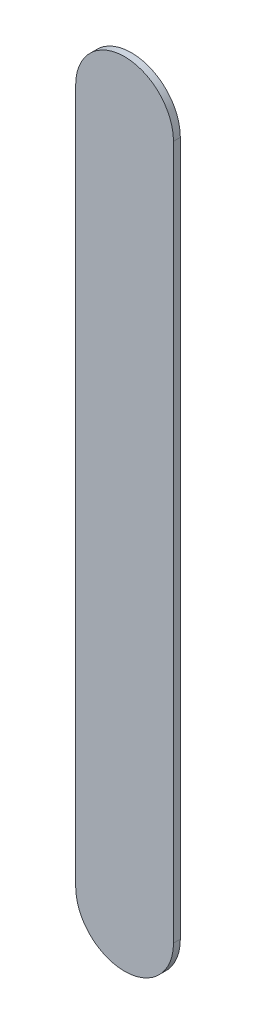
ISO-10303-21;
HEADER;
FILE_DESCRIPTION(('STEP AP214'),'2;1');
FILE_NAME('part.step','',(''),(''),'','','');
FILE_SCHEMA(('AUTOMOTIVE_DESIGN { 1 0 10303 214 1 1 1 1 }'));
ENDSEC;
DATA;
#1=APPLICATION_CONTEXT('core data for automotive mechanical design processes');
#2=APPLICATION_PROTOCOL_DEFINITION('international standard','automotive_design',2000,#1);
#3=PRODUCT_CONTEXT('',#1,'mechanical');
#4=PRODUCT('Part','Part','',(#3));
#5=PRODUCT_RELATED_PRODUCT_CATEGORY('part','',(#4));
#6=PRODUCT_DEFINITION_FORMATION('','',#4);
#7=PRODUCT_DEFINITION_CONTEXT('part definition',#1,'design');
#8=PRODUCT_DEFINITION('design','',#6,#7);
#9=PRODUCT_DEFINITION_SHAPE('','',#8);
#10=(LENGTH_UNIT() NAMED_UNIT(*) SI_UNIT(.MILLI.,.METRE.));
#11=(NAMED_UNIT(*) PLANE_ANGLE_UNIT() SI_UNIT($,.RADIAN.));
#12=(NAMED_UNIT(*) SI_UNIT($,.STERADIAN.) SOLID_ANGLE_UNIT());
#13=UNCERTAINTY_MEASURE_WITH_UNIT(LENGTH_MEASURE(1.E-05),#10,'distance_accuracy_value','');
#14=(GEOMETRIC_REPRESENTATION_CONTEXT(3) GLOBAL_UNCERTAINTY_ASSIGNED_CONTEXT((#13)) GLOBAL_UNIT_ASSIGNED_CONTEXT((#10,
#11,#12)) REPRESENTATION_CONTEXT('',''));
#15=CARTESIAN_POINT('',(0.,0.,0.));
#16=DIRECTION('',(0.,0.,1.));
#17=DIRECTION('',(1.,0.,0.));
#18=AXIS2_PLACEMENT_3D('',#15,#16,#17);
#19=CARTESIAN_POINT('',(113.52,-56.91,1.635));
#20=DIRECTION('',(0.,0.,1.));
#21=DIRECTION('',(1.,0.,0.));
#22=AXIS2_PLACEMENT_3D('',#19,#20,#21);
#23=PLANE('',#22);
#24=DIRECTION('',(0.,-1.,0.));
#25=VECTOR('',#24,1.);
#26=CARTESIAN_POINT('',(113.52,-56.91,1.635));
#27=LINE('',#26,#25);
#28=CARTESIAN_POINT('',(113.52,-56.91,1.635));
#29=VERTEX_POINT('',#28);
#30=CARTESIAN_POINT('',(113.52,-60.46,1.635));
#31=VERTEX_POINT('',#30);
#32=EDGE_CURVE('E82',#29,#31,#27,.T.);
#33=ORIENTED_EDGE('',*,*,#32,.T.);
#34=CARTESIAN_POINT('',(113.77,-60.46,1.635));
#35=DIRECTION('',(0.,0.,1.));
#36=DIRECTION('',(-1.,0.,0.));
#37=AXIS2_PLACEMENT_3D('',#34,#35,#36);
#38=CIRCLE('',#37,0.25);
#39=CARTESIAN_POINT('',(114.02,-60.46,1.635));
#40=VERTEX_POINT('',#39);
#41=EDGE_CURVE('E110',#31,#40,#38,.T.);
#42=ORIENTED_EDGE('',*,*,#41,.T.);
#43=DIRECTION('',(0.,1.,0.));
#44=VECTOR('',#43,1.);
#45=CARTESIAN_POINT('',(114.02,-60.46,1.635));
#46=LINE('',#45,#44);
#47=CARTESIAN_POINT('',(114.02,-56.91,1.635));
#48=VERTEX_POINT('',#47);
#49=EDGE_CURVE('E75',#40,#48,#46,.T.);
#50=ORIENTED_EDGE('',*,*,#49,.T.);
#51=CARTESIAN_POINT('',(113.77,-56.91,1.635));
#52=DIRECTION('',(0.,0.,1.));
#53=DIRECTION('',(1.,0.,0.));
#54=AXIS2_PLACEMENT_3D('',#51,#52,#53);
#55=CIRCLE('',#54,0.25);
#56=EDGE_CURVE('E11',#48,#29,#55,.T.);
#57=ORIENTED_EDGE('',*,*,#56,.T.);
#58=EDGE_LOOP('',(#33,#42,#50,#57));
#59=FACE_BOUND('',#58,.T.);
#60=ADVANCED_FACE('F17',(#59),#23,.T.);
#61=CARTESIAN_POINT('',(113.52,-56.91,1.6));
#62=DIRECTION('',(0.,0.,1.));
#63=DIRECTION('',(1.,0.,0.));
#64=AXIS2_PLACEMENT_3D('',#61,#62,#63);
#65=PLANE('',#64);
#66=CARTESIAN_POINT('',(113.77,-56.91,1.6));
#67=DIRECTION('',(0.,0.,1.));
#68=DIRECTION('',(1.,0.,0.));
#69=AXIS2_PLACEMENT_3D('',#66,#67,#68);
#70=CIRCLE('',#69,0.25);
#71=CARTESIAN_POINT('',(114.02,-56.91,1.6));
#72=VERTEX_POINT('',#71);
#73=CARTESIAN_POINT('',(113.52,-56.91,1.6));
#74=VERTEX_POINT('',#73);
#75=EDGE_CURVE('E20',#72,#74,#70,.T.);
#76=ORIENTED_EDGE('',*,*,#75,.F.);
#77=DIRECTION('',(0.,1.,0.));
#78=VECTOR('',#77,1.);
#79=CARTESIAN_POINT('',(114.02,-60.46,1.6));
#80=LINE('',#79,#78);
#81=CARTESIAN_POINT('',(114.02,-60.46,1.6));
#82=VERTEX_POINT('',#81);
#83=EDGE_CURVE('E98',#82,#72,#80,.T.);
#84=ORIENTED_EDGE('',*,*,#83,.F.);
#85=CARTESIAN_POINT('',(113.77,-60.46,1.6));
#86=DIRECTION('',(0.,0.,1.));
#87=DIRECTION('',(-1.,0.,0.));
#88=AXIS2_PLACEMENT_3D('',#85,#86,#87);
#89=CIRCLE('',#88,0.25);
#90=CARTESIAN_POINT('',(113.52,-60.46,1.6));
#91=VERTEX_POINT('',#90);
#92=EDGE_CURVE('E84',#91,#82,#89,.T.);
#93=ORIENTED_EDGE('',*,*,#92,.F.);
#94=DIRECTION('',(0.,-1.,0.));
#95=VECTOR('',#94,1.);
#96=CARTESIAN_POINT('',(113.52,-56.91,1.6));
#97=LINE('',#96,#95);
#98=EDGE_CURVE('E80',#74,#91,#97,.T.);
#99=ORIENTED_EDGE('',*,*,#98,.F.);
#100=EDGE_LOOP('',(#76,#84,#93,#99));
#101=FACE_BOUND('',#100,.T.);
#102=ADVANCED_FACE('F86',(#101),#65,.F.);
#103=CARTESIAN_POINT('',(113.77,-56.91,1.6));
#104=DIRECTION('',(0.,0.,-1.));
#105=DIRECTION('',(1.,0.,0.));
#106=AXIS2_PLACEMENT_3D('',#103,#104,#105);
#107=CYLINDRICAL_SURFACE('',#106,0.25);
#108=ORIENTED_EDGE('',*,*,#75,.T.);
#109=DIRECTION('',(0.,0.,1.));
#110=VECTOR('',#109,1.);
#111=CARTESIAN_POINT('',(113.52,-56.91,1.6));
#112=LINE('',#111,#110);
#113=EDGE_CURVE('E69',#74,#29,#112,.T.);
#114=ORIENTED_EDGE('',*,*,#113,.T.);
#115=ORIENTED_EDGE('',*,*,#56,.F.);
#116=DIRECTION('',(0.,0.,1.));
#117=VECTOR('',#116,1.);
#118=CARTESIAN_POINT('',(114.02,-56.91,1.6));
#119=LINE('',#118,#117);
#120=EDGE_CURVE('E72',#72,#48,#119,.T.);
#121=ORIENTED_EDGE('',*,*,#120,.F.);
#122=EDGE_LOOP('',(#108,#114,#115,#121));
#123=FACE_BOUND('',#122,.T.);
#124=ADVANCED_FACE('F68',(#123),#107,.T.);
#125=CARTESIAN_POINT('',(114.02,-60.46,1.6));
#126=DIRECTION('',(-1.,0.,0.));
#127=DIRECTION('',(0.,0.,1.));
#128=AXIS2_PLACEMENT_3D('',#125,#126,#127);
#129=PLANE('',#128);
#130=ORIENTED_EDGE('',*,*,#83,.T.);
#131=ORIENTED_EDGE('',*,*,#120,.T.);
#132=ORIENTED_EDGE('',*,*,#49,.F.);
#133=DIRECTION('',(0.,0.,1.));
#134=VECTOR('',#133,1.);
#135=CARTESIAN_POINT('',(114.02,-60.46,1.6));
#136=LINE('',#135,#134);
#137=EDGE_CURVE('E105',#82,#40,#136,.T.);
#138=ORIENTED_EDGE('',*,*,#137,.F.);
#139=EDGE_LOOP('',(#130,#131,#132,#138));
#140=FACE_BOUND('',#139,.T.);
#141=ADVANCED_FACE('F121',(#140),#129,.F.);
#142=CARTESIAN_POINT('',(113.77,-60.46,1.6));
#143=DIRECTION('',(0.,0.,-1.));
#144=DIRECTION('',(-1.,0.,0.));
#145=AXIS2_PLACEMENT_3D('',#142,#143,#144);
#146=CYLINDRICAL_SURFACE('',#145,0.25);
#147=ORIENTED_EDGE('',*,*,#92,.T.);
#148=ORIENTED_EDGE('',*,*,#137,.T.);
#149=ORIENTED_EDGE('',*,*,#41,.F.);
#150=DIRECTION('',(0.,0.,1.));
#151=VECTOR('',#150,1.);
#152=CARTESIAN_POINT('',(113.52,-60.46,1.6));
#153=LINE('',#152,#151);
#154=EDGE_CURVE('E90',#91,#31,#153,.T.);
#155=ORIENTED_EDGE('',*,*,#154,.F.);
#156=EDGE_LOOP('',(#147,#148,#149,#155));
#157=FACE_BOUND('',#156,.T.);
#158=ADVANCED_FACE('F123',(#157),#146,.T.);
#159=CARTESIAN_POINT('',(113.52,-56.91,1.6));
#160=DIRECTION('',(1.,0.,0.));
#161=DIRECTION('',(0.,1.,0.));
#162=AXIS2_PLACEMENT_3D('',#159,#160,#161);
#163=PLANE('',#162);
#164=ORIENTED_EDGE('',*,*,#98,.T.);
#165=ORIENTED_EDGE('',*,*,#154,.T.);
#166=ORIENTED_EDGE('',*,*,#32,.F.);
#167=ORIENTED_EDGE('',*,*,#113,.F.);
#168=EDGE_LOOP('',(#164,#165,#166,#167));
#169=FACE_BOUND('',#168,.T.);
#170=ADVANCED_FACE('F78',(#169),#163,.F.);
#171=CLOSED_SHELL('',(#60,#102,#124,#141,#158,#170));
#172=MANIFOLD_SOLID_BREP('B1',#171);
#173=ADVANCED_BREP_SHAPE_REPRESENTATION('',(#18,#172),#14);
#174=SHAPE_DEFINITION_REPRESENTATION(#9,#173);
ENDSEC;
END-ISO-10303-21;
